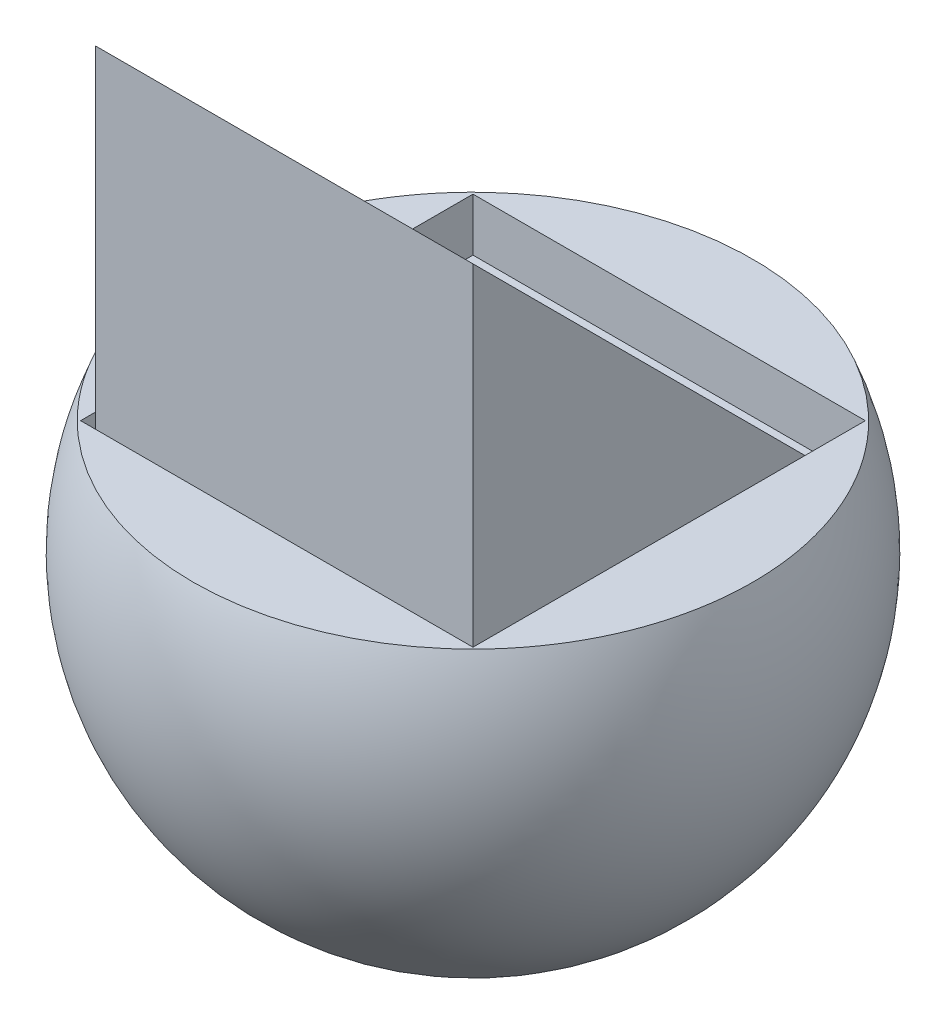
ISO-10303-21;
HEADER;
FILE_DESCRIPTION(('STEP AP214'),'2;1');
FILE_NAME('part.step','',(''),(''),'','','');
FILE_SCHEMA(('AUTOMOTIVE_DESIGN { 1 0 10303 214 1 1 1 1 }'));
ENDSEC;
DATA;
#1=APPLICATION_CONTEXT('core data for automotive mechanical design processes');
#2=APPLICATION_PROTOCOL_DEFINITION('international standard','automotive_design',2000,#1);
#3=PRODUCT_CONTEXT('',#1,'mechanical');
#4=PRODUCT('Part','Part','',(#3));
#5=PRODUCT_RELATED_PRODUCT_CATEGORY('part','',(#4));
#6=PRODUCT_DEFINITION_FORMATION('','',#4);
#7=PRODUCT_DEFINITION_CONTEXT('part definition',#1,'design');
#8=PRODUCT_DEFINITION('design','',#6,#7);
#9=PRODUCT_DEFINITION_SHAPE('','',#8);
#10=(LENGTH_UNIT() NAMED_UNIT(*) SI_UNIT(.MILLI.,.METRE.));
#11=(NAMED_UNIT(*) PLANE_ANGLE_UNIT() SI_UNIT($,.RADIAN.));
#12=(NAMED_UNIT(*) SI_UNIT($,.STERADIAN.) SOLID_ANGLE_UNIT());
#13=UNCERTAINTY_MEASURE_WITH_UNIT(LENGTH_MEASURE(1.E-05),#10,'distance_accuracy_value','');
#14=(GEOMETRIC_REPRESENTATION_CONTEXT(3) GLOBAL_UNCERTAINTY_ASSIGNED_CONTEXT((#13)) GLOBAL_UNIT_ASSIGNED_CONTEXT((#10,
#11,#12)) REPRESENTATION_CONTEXT('',''));
#15=CARTESIAN_POINT('',(0.,0.,0.));
#16=DIRECTION('',(0.,0.,1.));
#17=DIRECTION('',(1.,0.,0.));
#18=AXIS2_PLACEMENT_3D('',#15,#16,#17);
#19=CARTESIAN_POINT('',(2.5,0.800000000000001,-2.49999999999997));
#20=DIRECTION('',(0.,-0.707106781186544,0.707106781186551));
#21=DIRECTION('',(0.,-0.707106781186551,-0.707106781186544));
#22=AXIS2_PLACEMENT_3D('',#19,#20,#21);
#23=PLANE('',#22);
#24=DIRECTION('',(0.,0.707106781186551,0.707106781186544));
#25=VECTOR('',#24,1.);
#26=CARTESIAN_POINT('',(-2.5,0.800000000000001,-2.49999999999997));
#27=LINE('',#26,#25);
#28=CARTESIAN_POINT('',(-2.5,0.800000000000001,-2.49999999999997));
#29=VERTEX_POINT('',#28);
#30=CARTESIAN_POINT('',(-2.5,5.8,2.49999999999997));
#31=VERTEX_POINT('',#30);
#32=EDGE_CURVE('E129',#29,#31,#27,.T.);
#33=ORIENTED_EDGE('',*,*,#32,.T.);
#34=DIRECTION('',(-1.,0.,0.));
#35=VECTOR('',#34,1.);
#36=CARTESIAN_POINT('',(2.5,5.8,2.49999999999997));
#37=LINE('',#36,#35);
#38=CARTESIAN_POINT('',(2.5,5.8,2.49999999999997));
#39=VERTEX_POINT('',#38);
#40=EDGE_CURVE('E13',#39,#31,#37,.T.);
#41=ORIENTED_EDGE('',*,*,#40,.F.);
#42=DIRECTION('',(0.,0.707106781186551,0.707106781186544));
#43=VECTOR('',#42,1.);
#44=CARTESIAN_POINT('',(2.5,0.800000000000001,-2.49999999999997));
#45=LINE('',#44,#43);
#46=CARTESIAN_POINT('',(2.5,0.800000000000001,-2.49999999999997));
#47=VERTEX_POINT('',#46);
#48=EDGE_CURVE('E121',#47,#39,#45,.T.);
#49=ORIENTED_EDGE('',*,*,#48,.F.);
#50=DIRECTION('',(-1.,0.,0.));
#51=VECTOR('',#50,1.);
#52=CARTESIAN_POINT('',(2.5,0.800000000000001,-2.49999999999997));
#53=LINE('',#52,#51);
#54=EDGE_CURVE('E130',#47,#29,#53,.T.);
#55=ORIENTED_EDGE('',*,*,#54,.T.);
#56=EDGE_LOOP('',(#33,#41,#49,#55));
#57=FACE_BOUND('',#56,.T.);
#58=ADVANCED_FACE('F79',(#57),#23,.F.);
#59=CARTESIAN_POINT('',(2.5,5.8,2.49999999999997));
#60=DIRECTION('',(0.,0.,-1.));
#61=DIRECTION('',(0.,1.,0.));
#62=AXIS2_PLACEMENT_3D('',#59,#60,#61);
#63=PLANE('',#62);
#64=DIRECTION('',(0.,-1.,0.));
#65=VECTOR('',#64,1.);
#66=CARTESIAN_POINT('',(-2.5,5.8,2.49999999999997));
#67=LINE('',#66,#65);
#68=CARTESIAN_POINT('',(-2.5,0.8,2.49999999999997));
#69=VERTEX_POINT('',#68);
#70=EDGE_CURVE('E108',#31,#69,#67,.T.);
#71=ORIENTED_EDGE('',*,*,#70,.T.);
#72=DIRECTION('',(-1.,0.,0.));
#73=VECTOR('',#72,1.);
#74=CARTESIAN_POINT('',(2.5,0.8,2.49999999999997));
#75=LINE('',#74,#73);
#76=CARTESIAN_POINT('',(2.5,0.8,2.49999999999997));
#77=VERTEX_POINT('',#76);
#78=EDGE_CURVE('E88',#77,#69,#75,.T.);
#79=ORIENTED_EDGE('',*,*,#78,.F.);
#80=DIRECTION('',(0.,-1.,0.));
#81=VECTOR('',#80,1.);
#82=CARTESIAN_POINT('',(2.5,5.8,2.49999999999997));
#83=LINE('',#82,#81);
#84=EDGE_CURVE('E116',#39,#77,#83,.T.);
#85=ORIENTED_EDGE('',*,*,#84,.F.);
#86=ORIENTED_EDGE('',*,*,#40,.T.);
#87=EDGE_LOOP('',(#71,#79,#85,#86));
#88=FACE_BOUND('',#87,.T.);
#89=ADVANCED_FACE('F117',(#88),#63,.F.);
#90=CARTESIAN_POINT('',(2.5,0.8,2.49999999999997));
#91=DIRECTION('',(0.,1.,0.));
#92=DIRECTION('',(0.,0.,1.));
#93=AXIS2_PLACEMENT_3D('',#90,#91,#92);
#94=PLANE('',#93);
#95=DIRECTION('',(0.,0.,-1.));
#96=VECTOR('',#95,1.);
#97=CARTESIAN_POINT('',(-2.5,0.8,2.49999999999997));
#98=LINE('',#97,#96);
#99=EDGE_CURVE('E113',#69,#29,#98,.T.);
#100=ORIENTED_EDGE('',*,*,#99,.T.);
#101=ORIENTED_EDGE('',*,*,#54,.F.);
#102=DIRECTION('',(0.,0.,-1.));
#103=VECTOR('',#102,1.);
#104=CARTESIAN_POINT('',(2.5,0.8,2.49999999999997));
#105=LINE('',#104,#103);
#106=EDGE_CURVE('E96',#77,#47,#105,.T.);
#107=ORIENTED_EDGE('',*,*,#106,.F.);
#108=ORIENTED_EDGE('',*,*,#78,.T.);
#109=EDGE_LOOP('',(#100,#101,#107,#108));
#110=FACE_BOUND('',#109,.T.);
#111=ADVANCED_FACE('F142',(#110),#94,.F.);
#112=CARTESIAN_POINT('',(2.5,0.,0.));
#113=DIRECTION('',(1.,0.,0.));
#114=DIRECTION('',(0.,0.,-1.));
#115=AXIS2_PLACEMENT_3D('',#112,#113,#114);
#116=PLANE('',#115);
#117=ORIENTED_EDGE('',*,*,#48,.T.);
#118=ORIENTED_EDGE('',*,*,#84,.T.);
#119=ORIENTED_EDGE('',*,*,#106,.T.);
#120=EDGE_LOOP('',(#117,#118,#119));
#121=FACE_BOUND('',#120,.T.);
#122=ADVANCED_FACE('F124',(#121),#116,.T.);
#123=CARTESIAN_POINT('',(-2.5,0.,0.));
#124=DIRECTION('',(1.,0.,0.));
#125=DIRECTION('',(0.,0.,-1.));
#126=AXIS2_PLACEMENT_3D('',#123,#124,#125);
#127=PLANE('',#126);
#128=ORIENTED_EDGE('',*,*,#32,.F.);
#129=ORIENTED_EDGE('',*,*,#99,.F.);
#130=ORIENTED_EDGE('',*,*,#70,.F.);
#131=EDGE_LOOP('',(#128,#129,#130));
#132=FACE_BOUND('',#131,.T.);
#133=ADVANCED_FACE('F143',(#132),#127,.F.);
#134=CLOSED_SHELL('',(#58,#89,#111,#122,#133));
#135=MANIFOLD_SOLID_BREP('B2',#134);
#136=CARTESIAN_POINT('',(0.,0.,0.));
#137=DIRECTION('',(-1.,0.,0.));
#138=DIRECTION('',(0.,0.,-1.));
#139=AXIS2_PLACEMENT_3D('',#136,#137,#138);
#140=SPHERICAL_SURFACE('',#139,4.);
#141=CARTESIAN_POINT('',(0.,-0.5,0.));
#142=DIRECTION('',(0.,-1.,0.));
#143=DIRECTION('',(0.,0.,-1.));
#144=AXIS2_PLACEMENT_3D('',#141,#142,#143);
#145=CIRCLE('',#144,3.96862696659689);
#146=CARTESIAN_POINT('',(-3.9370039370059,-0.5,-0.5));
#147=VERTEX_POINT('',#146);
#148=CARTESIAN_POINT('',(-3.9370039370059,-0.5,0.5));
#149=VERTEX_POINT('',#148);
#150=EDGE_CURVE('E320',#147,#149,#145,.F.);
#151=ORIENTED_EDGE('',*,*,#150,.F.);
#152=CARTESIAN_POINT('',(0.,0.,-0.5));
#153=DIRECTION('',(0.,0.,-1.));
#154=DIRECTION('',(-1.,0.,0.));
#155=AXIS2_PLACEMENT_3D('',#152,#153,#154);
#156=CIRCLE('',#155,3.96862696659689);
#157=CARTESIAN_POINT('',(-3.9370039370059,0.5,-0.5));
#158=VERTEX_POINT('',#157);
#159=EDGE_CURVE('E317',#158,#147,#156,.F.);
#160=ORIENTED_EDGE('',*,*,#159,.F.);
#161=CARTESIAN_POINT('',(0.,0.5,0.));
#162=DIRECTION('',(0.,1.,0.));
#163=DIRECTION('',(0.,0.,1.));
#164=AXIS2_PLACEMENT_3D('',#161,#162,#163);
#165=CIRCLE('',#164,3.96862696659689);
#166=CARTESIAN_POINT('',(-3.9370039370059,0.5,0.5));
#167=VERTEX_POINT('',#166);
#168=EDGE_CURVE('E314',#167,#158,#165,.F.);
#169=ORIENTED_EDGE('',*,*,#168,.F.);
#170=CARTESIAN_POINT('',(0.,0.,0.5));
#171=DIRECTION('',(0.,0.,1.));
#172=DIRECTION('',(0.,-1.,0.));
#173=AXIS2_PLACEMENT_3D('',#170,#171,#172);
#174=CIRCLE('',#173,3.96862696659689);
#175=EDGE_CURVE('E311',#149,#167,#174,.F.);
#176=ORIENTED_EDGE('',*,*,#175,.F.);
#177=EDGE_LOOP('',(#151,#160,#169,#176));
#178=FACE_BOUND('',#177,.T.);
#179=CARTESIAN_POINT('',(0.,-3.70809924354783,0.));
#180=DIRECTION('',(0.,1.,0.));
#181=DIRECTION('',(0.,0.,1.));
#182=AXIS2_PLACEMENT_3D('',#179,#180,#181);
#183=CIRCLE('',#182,1.5);
#184=CARTESIAN_POINT('',(0.,-3.70809924354783,1.5));
#185=VERTEX_POINT('',#184);
#186=EDGE_CURVE('E328',#185,#185,#183,.F.);
#187=ORIENTED_EDGE('',*,*,#186,.F.);
#188=EDGE_LOOP('',(#187));
#189=FACE_BOUND('',#188,.T.);
#190=CARTESIAN_POINT('',(0.,1.5,0.));
#191=DIRECTION('',(0.,1.,0.));
#192=DIRECTION('',(0.,0.,1.));
#193=AXIS2_PLACEMENT_3D('',#190,#191,#192);
#194=CIRCLE('',#193,3.70809924354783);
#195=CARTESIAN_POINT('',(0.,1.5,3.70809924354783));
#196=VERTEX_POINT('',#195);
#197=EDGE_CURVE('E323',#196,#196,#194,.F.);
#198=ORIENTED_EDGE('',*,*,#197,.T.);
#199=EDGE_LOOP('',(#198));
#200=FACE_BOUND('',#199,.T.);
#201=ADVANCED_FACE('F191',(#178,#189,#200),#140,.T.);
#202=CARTESIAN_POINT('',(0.,-4.,0.));
#203=DIRECTION('',(0.,1.,0.));
#204=DIRECTION('',(0.,0.,1.));
#205=AXIS2_PLACEMENT_3D('',#202,#203,#204);
#206=CYLINDRICAL_SURFACE('',#205,1.5);
#207=DIRECTION('',(0.,1.,0.));
#208=VECTOR('',#207,1.);
#209=CARTESIAN_POINT('',(-1.4142135623731,-4.,-0.5));
#210=LINE('',#209,#208);
#211=CARTESIAN_POINT('',(-1.41421356237309,0.5,-0.5));
#212=VERTEX_POINT('',#211);
#213=CARTESIAN_POINT('',(-1.4142135623731,-0.5,-0.5));
#214=VERTEX_POINT('',#213);
#215=EDGE_CURVE('E199',#212,#214,#210,.F.);
#216=ORIENTED_EDGE('',*,*,#215,.T.);
#217=CARTESIAN_POINT('',(0.,-0.5,0.));
#218=DIRECTION('',(0.,-1.,0.));
#219=DIRECTION('',(0.,0.,-1.));
#220=AXIS2_PLACEMENT_3D('',#217,#218,#219);
#221=CIRCLE('',#220,1.5);
#222=CARTESIAN_POINT('',(-1.4142135623731,-0.5,0.5));
#223=VERTEX_POINT('',#222);
#224=EDGE_CURVE('E77',#214,#223,#221,.F.);
#225=ORIENTED_EDGE('',*,*,#224,.T.);
#226=DIRECTION('',(0.,1.,0.));
#227=VECTOR('',#226,1.);
#228=CARTESIAN_POINT('',(-1.4142135623731,-4.,0.499999999999999));
#229=LINE('',#228,#227);
#230=CARTESIAN_POINT('',(-1.4142135623731,0.5,0.499999999999999));
#231=VERTEX_POINT('',#230);
#232=EDGE_CURVE('E332',#223,#231,#229,.T.);
#233=ORIENTED_EDGE('',*,*,#232,.T.);
#234=CARTESIAN_POINT('',(0.,0.5,0.));
#235=DIRECTION('',(0.,1.,0.));
#236=DIRECTION('',(0.,0.,1.));
#237=AXIS2_PLACEMENT_3D('',#234,#235,#236);
#238=CIRCLE('',#237,1.5);
#239=EDGE_CURVE('E339',#231,#212,#238,.F.);
#240=ORIENTED_EDGE('',*,*,#239,.T.);
#241=EDGE_LOOP('',(#216,#225,#233,#240));
#242=FACE_BOUND('',#241,.T.);
#243=ORIENTED_EDGE('',*,*,#186,.T.);
#244=EDGE_LOOP('',(#243));
#245=FACE_BOUND('',#244,.T.);
#246=CARTESIAN_POINT('',(0.,0.8,0.));
#247=DIRECTION('',(0.,1.,0.));
#248=DIRECTION('',(0.,0.,1.));
#249=AXIS2_PLACEMENT_3D('',#246,#247,#248);
#250=CIRCLE('',#249,1.5);
#251=CARTESIAN_POINT('',(0.,0.8,1.5));
#252=VERTEX_POINT('',#251);
#253=EDGE_CURVE('E327',#252,#252,#250,.F.);
#254=ORIENTED_EDGE('',*,*,#253,.F.);
#255=EDGE_LOOP('',(#254));
#256=FACE_BOUND('',#255,.T.);
#257=ADVANCED_FACE('F346',(#242,#245,#256),#206,.F.);
#258=CARTESIAN_POINT('',(0.,0.8,0.));
#259=DIRECTION('',(0.,1.,0.));
#260=DIRECTION('',(0.,0.,1.));
#261=AXIS2_PLACEMENT_3D('',#258,#259,#260);
#262=PLANE('',#261);
#263=ORIENTED_EDGE('',*,*,#253,.T.);
#264=EDGE_LOOP('',(#263));
#265=FACE_BOUND('',#264,.T.);
#266=DIRECTION('',(1.,0.,0.));
#267=VECTOR('',#266,1.);
#268=CARTESIAN_POINT('',(2.5,0.8,-2.6));
#269=LINE('',#268,#267);
#270=CARTESIAN_POINT('',(-2.6,0.8,-2.6));
#271=VERTEX_POINT('',#270);
#272=CARTESIAN_POINT('',(2.6,0.8,-2.6));
#273=VERTEX_POINT('',#272);
#274=EDGE_CURVE('E387',#271,#273,#269,.T.);
#275=ORIENTED_EDGE('',*,*,#274,.F.);
#276=DIRECTION('',(0.,0.,-1.));
#277=VECTOR('',#276,1.);
#278=CARTESIAN_POINT('',(-2.6,0.8,-2.5));
#279=LINE('',#278,#277);
#280=CARTESIAN_POINT('',(-2.6,0.8,2.6));
#281=VERTEX_POINT('',#280);
#282=EDGE_CURVE('E265',#281,#271,#279,.T.);
#283=ORIENTED_EDGE('',*,*,#282,.F.);
#284=DIRECTION('',(-1.,0.,0.));
#285=VECTOR('',#284,1.);
#286=CARTESIAN_POINT('',(-2.5,0.8,2.6));
#287=LINE('',#286,#285);
#288=CARTESIAN_POINT('',(2.6,0.8,2.6));
#289=VERTEX_POINT('',#288);
#290=EDGE_CURVE('E292',#289,#281,#287,.T.);
#291=ORIENTED_EDGE('',*,*,#290,.F.);
#292=DIRECTION('',(0.,0.,1.));
#293=VECTOR('',#292,1.);
#294=CARTESIAN_POINT('',(2.6,0.8,2.5));
#295=LINE('',#294,#293);
#296=EDGE_CURVE('E389',#273,#289,#295,.T.);
#297=ORIENTED_EDGE('',*,*,#296,.F.);
#298=EDGE_LOOP('',(#275,#283,#291,#297));
#299=FACE_BOUND('',#298,.T.);
#300=ADVANCED_FACE('F371',(#265,#299),#262,.T.);
#301=CARTESIAN_POINT('',(0.,1.5,0.));
#302=DIRECTION('',(0.,1.,0.));
#303=DIRECTION('',(0.,0.,1.));
#304=AXIS2_PLACEMENT_3D('',#301,#302,#303);
#305=PLANE('',#304);
#306=DIRECTION('',(0.,0.,1.));
#307=VECTOR('',#306,1.);
#308=CARTESIAN_POINT('',(-2.6,1.5,-2.5));
#309=LINE('',#308,#307);
#310=CARTESIAN_POINT('',(-2.6,1.5,-2.6));
#311=VERTEX_POINT('',#310);
#312=CARTESIAN_POINT('',(-2.6,1.5,2.6));
#313=VERTEX_POINT('',#312);
#314=EDGE_CURVE('E262',#311,#313,#309,.T.);
#315=ORIENTED_EDGE('',*,*,#314,.F.);
#316=DIRECTION('',(-1.,0.,0.));
#317=VECTOR('',#316,1.);
#318=CARTESIAN_POINT('',(2.5,1.5,-2.6));
#319=LINE('',#318,#317);
#320=CARTESIAN_POINT('',(2.6,1.5,-2.6));
#321=VERTEX_POINT('',#320);
#322=EDGE_CURVE('E272',#321,#311,#319,.T.);
#323=ORIENTED_EDGE('',*,*,#322,.F.);
#324=DIRECTION('',(0.,0.,-1.));
#325=VECTOR('',#324,1.);
#326=CARTESIAN_POINT('',(2.6,1.5,2.5));
#327=LINE('',#326,#325);
#328=CARTESIAN_POINT('',(2.6,1.5,2.6));
#329=VERTEX_POINT('',#328);
#330=EDGE_CURVE('E206',#329,#321,#327,.T.);
#331=ORIENTED_EDGE('',*,*,#330,.F.);
#332=DIRECTION('',(1.,0.,0.));
#333=VECTOR('',#332,1.);
#334=CARTESIAN_POINT('',(-2.5,1.5,2.6));
#335=LINE('',#334,#333);
#336=EDGE_CURVE('E281',#313,#329,#335,.T.);
#337=ORIENTED_EDGE('',*,*,#336,.F.);
#338=EDGE_LOOP('',(#315,#323,#331,#337));
#339=FACE_BOUND('',#338,.T.);
#340=ORIENTED_EDGE('',*,*,#197,.F.);
#341=EDGE_LOOP('',(#340));
#342=FACE_BOUND('',#341,.T.);
#343=ADVANCED_FACE('F278',(#339,#342),#305,.T.);
#344=CARTESIAN_POINT('',(-6.001,-0.5,-0.5));
#345=DIRECTION('',(0.,-1.,0.));
#346=DIRECTION('',(0.,0.,-1.));
#347=AXIS2_PLACEMENT_3D('',#344,#345,#346);
#348=PLANE('',#347);
#349=ORIENTED_EDGE('',*,*,#150,.T.);
#350=DIRECTION('',(1.,0.,0.));
#351=VECTOR('',#350,1.);
#352=CARTESIAN_POINT('',(-6.001,-0.5,0.5));
#353=LINE('',#352,#351);
#354=EDGE_CURVE('E214',#149,#223,#353,.T.);
#355=ORIENTED_EDGE('',*,*,#354,.T.);
#356=ORIENTED_EDGE('',*,*,#224,.F.);
#357=DIRECTION('',(1.,0.,0.));
#358=VECTOR('',#357,1.);
#359=CARTESIAN_POINT('',(-6.001,-0.5,-0.5));
#360=LINE('',#359,#358);
#361=EDGE_CURVE('E305',#147,#214,#360,.T.);
#362=ORIENTED_EDGE('',*,*,#361,.F.);
#363=EDGE_LOOP('',(#349,#355,#356,#362));
#364=FACE_BOUND('',#363,.T.);
#365=ADVANCED_FACE('F363',(#364),#348,.F.);
#366=CARTESIAN_POINT('',(-6.001,-0.5,-0.5));
#367=DIRECTION('',(0.,0.,-1.));
#368=DIRECTION('',(-1.,0.,0.));
#369=AXIS2_PLACEMENT_3D('',#366,#367,#368);
#370=PLANE('',#369);
#371=ORIENTED_EDGE('',*,*,#159,.T.);
#372=ORIENTED_EDGE('',*,*,#361,.T.);
#373=ORIENTED_EDGE('',*,*,#215,.F.);
#374=DIRECTION('',(1.,0.,0.));
#375=VECTOR('',#374,1.);
#376=CARTESIAN_POINT('',(-6.001,0.5,-0.5));
#377=LINE('',#376,#375);
#378=EDGE_CURVE('E301',#158,#212,#377,.T.);
#379=ORIENTED_EDGE('',*,*,#378,.F.);
#380=EDGE_LOOP('',(#371,#372,#373,#379));
#381=FACE_BOUND('',#380,.T.);
#382=ADVANCED_FACE('F351',(#381),#370,.F.);
#383=CARTESIAN_POINT('',(-6.001,0.5,-0.5));
#384=DIRECTION('',(0.,1.,0.));
#385=DIRECTION('',(0.,0.,1.));
#386=AXIS2_PLACEMENT_3D('',#383,#384,#385);
#387=PLANE('',#386);
#388=ORIENTED_EDGE('',*,*,#168,.T.);
#389=ORIENTED_EDGE('',*,*,#378,.T.);
#390=ORIENTED_EDGE('',*,*,#239,.F.);
#391=DIRECTION('',(1.,0.,0.));
#392=VECTOR('',#391,1.);
#393=CARTESIAN_POINT('',(-6.001,0.5,0.5));
#394=LINE('',#393,#392);
#395=EDGE_CURVE('E298',#167,#231,#394,.T.);
#396=ORIENTED_EDGE('',*,*,#395,.F.);
#397=EDGE_LOOP('',(#388,#389,#390,#396));
#398=FACE_BOUND('',#397,.T.);
#399=ADVANCED_FACE('F355',(#398),#387,.F.);
#400=CARTESIAN_POINT('',(-6.001,-0.5,0.5));
#401=DIRECTION('',(0.,0.,1.));
#402=DIRECTION('',(0.,-1.,0.));
#403=AXIS2_PLACEMENT_3D('',#400,#401,#402);
#404=PLANE('',#403);
#405=ORIENTED_EDGE('',*,*,#175,.T.);
#406=ORIENTED_EDGE('',*,*,#395,.T.);
#407=ORIENTED_EDGE('',*,*,#232,.F.);
#408=ORIENTED_EDGE('',*,*,#354,.F.);
#409=EDGE_LOOP('',(#405,#406,#407,#408));
#410=FACE_BOUND('',#409,.T.);
#411=ADVANCED_FACE('F410',(#410),#404,.F.);
#412=CARTESIAN_POINT('',(-2.6,-6.55391052434009,-2.5));
#413=DIRECTION('',(-1.,0.,0.));
#414=DIRECTION('',(0.,0.,1.));
#415=AXIS2_PLACEMENT_3D('',#412,#413,#414);
#416=PLANE('',#415);
#417=ORIENTED_EDGE('',*,*,#282,.T.);
#418=DIRECTION('',(0.,1.,0.));
#419=VECTOR('',#418,1.);
#420=CARTESIAN_POINT('',(-2.6,-6.55391052434009,-2.6));
#421=LINE('',#420,#419);
#422=EDGE_CURVE('E257',#271,#311,#421,.T.);
#423=ORIENTED_EDGE('',*,*,#422,.T.);
#424=ORIENTED_EDGE('',*,*,#314,.T.);
#425=DIRECTION('',(0.,1.,0.));
#426=VECTOR('',#425,1.);
#427=CARTESIAN_POINT('',(-2.6,-6.55391052434009,2.6));
#428=LINE('',#427,#426);
#429=EDGE_CURVE('E269',#281,#313,#428,.T.);
#430=ORIENTED_EDGE('',*,*,#429,.F.);
#431=EDGE_LOOP('',(#417,#423,#424,#430));
#432=FACE_BOUND('',#431,.T.);
#433=ADVANCED_FACE('F259',(#432),#416,.F.);
#434=CARTESIAN_POINT('',(-2.5,-6.55391052434009,2.6));
#435=DIRECTION('',(0.,0.,1.));
#436=DIRECTION('',(1.,0.,0.));
#437=AXIS2_PLACEMENT_3D('',#434,#435,#436);
#438=PLANE('',#437);
#439=ORIENTED_EDGE('',*,*,#290,.T.);
#440=ORIENTED_EDGE('',*,*,#429,.T.);
#441=ORIENTED_EDGE('',*,*,#336,.T.);
#442=DIRECTION('',(0.,1.,0.));
#443=VECTOR('',#442,1.);
#444=CARTESIAN_POINT('',(2.6,-6.55391052434009,2.6));
#445=LINE('',#444,#443);
#446=EDGE_CURVE('E293',#289,#329,#445,.T.);
#447=ORIENTED_EDGE('',*,*,#446,.F.);
#448=EDGE_LOOP('',(#439,#440,#441,#447));
#449=FACE_BOUND('',#448,.T.);
#450=ADVANCED_FACE('F398',(#449),#438,.F.);
#451=CARTESIAN_POINT('',(2.6,-6.55391052434009,2.5));
#452=DIRECTION('',(1.,0.,0.));
#453=DIRECTION('',(0.,0.,-1.));
#454=AXIS2_PLACEMENT_3D('',#451,#452,#453);
#455=PLANE('',#454);
#456=ORIENTED_EDGE('',*,*,#296,.T.);
#457=ORIENTED_EDGE('',*,*,#446,.T.);
#458=ORIENTED_EDGE('',*,*,#330,.T.);
#459=DIRECTION('',(0.,1.,0.));
#460=VECTOR('',#459,1.);
#461=CARTESIAN_POINT('',(2.6,-6.55391052434009,-2.6));
#462=LINE('',#461,#460);
#463=EDGE_CURVE('E274',#273,#321,#462,.T.);
#464=ORIENTED_EDGE('',*,*,#463,.F.);
#465=EDGE_LOOP('',(#456,#457,#458,#464));
#466=FACE_BOUND('',#465,.T.);
#467=ADVANCED_FACE('F399',(#466),#455,.F.);
#468=CARTESIAN_POINT('',(2.5,-6.55391052434009,-2.6));
#469=DIRECTION('',(0.,0.,-1.));
#470=DIRECTION('',(-1.,0.,0.));
#471=AXIS2_PLACEMENT_3D('',#468,#469,#470);
#472=PLANE('',#471);
#473=ORIENTED_EDGE('',*,*,#274,.T.);
#474=ORIENTED_EDGE('',*,*,#463,.T.);
#475=ORIENTED_EDGE('',*,*,#322,.T.);
#476=ORIENTED_EDGE('',*,*,#422,.F.);
#477=EDGE_LOOP('',(#473,#474,#475,#476));
#478=FACE_BOUND('',#477,.T.);
#479=ADVANCED_FACE('F273',(#478),#472,.F.);
#480=CLOSED_SHELL('',(#201,#257,#300,#343,#365,#382,#399,#411,#433,#450,#467,#479));
#481=MANIFOLD_SOLID_BREP('B7',#480);
#482=ADVANCED_BREP_SHAPE_REPRESENTATION('',(#18,#135,#481),#14);
#483=SHAPE_DEFINITION_REPRESENTATION(#9,#482);
ENDSEC;
END-ISO-10303-21;
